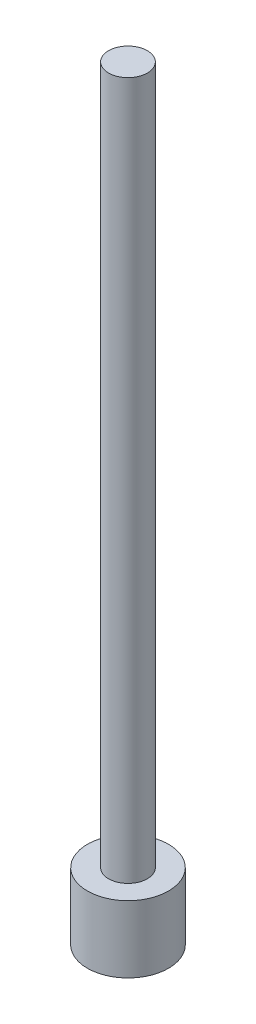
ISO-10303-21;
HEADER;
FILE_DESCRIPTION(('STEP AP214'),'2;1');
FILE_NAME('part.step','',(''),(''),'','','');
FILE_SCHEMA(('AUTOMOTIVE_DESIGN { 1 0 10303 214 1 1 1 1 }'));
ENDSEC;
DATA;
#1=APPLICATION_CONTEXT('core data for automotive mechanical design processes');
#2=APPLICATION_PROTOCOL_DEFINITION('international standard','automotive_design',2000,#1);
#3=PRODUCT_CONTEXT('',#1,'mechanical');
#4=PRODUCT('Part','Part','',(#3));
#5=PRODUCT_RELATED_PRODUCT_CATEGORY('part','',(#4));
#6=PRODUCT_DEFINITION_FORMATION('','',#4);
#7=PRODUCT_DEFINITION_CONTEXT('part definition',#1,'design');
#8=PRODUCT_DEFINITION('design','',#6,#7);
#9=PRODUCT_DEFINITION_SHAPE('','',#8);
#10=(LENGTH_UNIT() NAMED_UNIT(*) SI_UNIT(.MILLI.,.METRE.));
#11=(NAMED_UNIT(*) PLANE_ANGLE_UNIT() SI_UNIT($,.RADIAN.));
#12=(NAMED_UNIT(*) SI_UNIT($,.STERADIAN.) SOLID_ANGLE_UNIT());
#13=UNCERTAINTY_MEASURE_WITH_UNIT(LENGTH_MEASURE(1.E-05),#10,'distance_accuracy_value','');
#14=(GEOMETRIC_REPRESENTATION_CONTEXT(3) GLOBAL_UNCERTAINTY_ASSIGNED_CONTEXT((#13)) GLOBAL_UNIT_ASSIGNED_CONTEXT((#10,
#11,#12)) REPRESENTATION_CONTEXT('',''));
#15=CARTESIAN_POINT('',(0.,0.,0.));
#16=DIRECTION('',(0.,0.,1.));
#17=DIRECTION('',(1.,0.,0.));
#18=AXIS2_PLACEMENT_3D('',#15,#16,#17);
#19=CARTESIAN_POINT('',(0.,4.75,0.));
#20=DIRECTION('',(0.,-1.,0.));
#21=DIRECTION('',(0.,0.,-1.));
#22=AXIS2_PLACEMENT_3D('',#19,#20,#21);
#23=CYLINDRICAL_SURFACE('',#22,2.875);
#24=CARTESIAN_POINT('',(0.,4.75,0.));
#25=DIRECTION('',(0.,1.,0.));
#26=DIRECTION('',(0.,0.,1.));
#27=AXIS2_PLACEMENT_3D('',#24,#25,#26);
#28=CIRCLE('',#27,2.875);
#29=CARTESIAN_POINT('',(0.,4.75,2.875));
#30=VERTEX_POINT('',#29);
#31=EDGE_CURVE('E45',#30,#30,#28,.T.);
#32=ORIENTED_EDGE('',*,*,#31,.F.);
#33=EDGE_LOOP('',(#32));
#34=FACE_BOUND('',#33,.T.);
#35=CARTESIAN_POINT('',(0.,0.,0.));
#36=DIRECTION('',(0.,1.,0.));
#37=DIRECTION('',(0.,0.,1.));
#38=AXIS2_PLACEMENT_3D('',#35,#36,#37);
#39=CIRCLE('',#38,2.875);
#40=CARTESIAN_POINT('',(0.,0.,2.875));
#41=VERTEX_POINT('',#40);
#42=EDGE_CURVE('E40',#41,#41,#39,.T.);
#43=ORIENTED_EDGE('',*,*,#42,.T.);
#44=EDGE_LOOP('',(#43));
#45=FACE_BOUND('',#44,.T.);
#46=ADVANCED_FACE('F37',(#34,#45),#23,.T.);
#47=CARTESIAN_POINT('',(0.,4.75,0.));
#48=DIRECTION('',(0.,1.,0.));
#49=DIRECTION('',(0.,0.,1.));
#50=AXIS2_PLACEMENT_3D('',#47,#48,#49);
#51=PLANE('',#50);
#52=CARTESIAN_POINT('',(0.,4.75,0.));
#53=DIRECTION('',(0.,1.,0.));
#54=DIRECTION('',(0.,0.,1.));
#55=AXIS2_PLACEMENT_3D('',#52,#53,#54);
#56=CIRCLE('',#55,1.375);
#57=CARTESIAN_POINT('',(0.,4.75,1.375));
#58=VERTEX_POINT('',#57);
#59=EDGE_CURVE('E10',#58,#58,#56,.T.);
#60=ORIENTED_EDGE('',*,*,#59,.F.);
#61=EDGE_LOOP('',(#60));
#62=FACE_BOUND('',#61,.T.);
#63=ORIENTED_EDGE('',*,*,#31,.T.);
#64=EDGE_LOOP('',(#63));
#65=FACE_BOUND('',#64,.T.);
#66=ADVANCED_FACE('F65',(#62,#65),#51,.T.);
#67=CARTESIAN_POINT('',(0.,0.,0.));
#68=DIRECTION('',(0.,1.,0.));
#69=DIRECTION('',(0.,0.,1.));
#70=AXIS2_PLACEMENT_3D('',#67,#68,#69);
#71=PLANE('',#70);
#72=ORIENTED_EDGE('',*,*,#42,.F.);
#73=EDGE_LOOP('',(#72));
#74=FACE_BOUND('',#73,.T.);
#75=ADVANCED_FACE('F62',(#74),#71,.F.);
#76=CARTESIAN_POINT('',(0.,54.25,0.));
#77=DIRECTION('',(0.,-1.,0.));
#78=DIRECTION('',(0.,0.,-1.));
#79=AXIS2_PLACEMENT_3D('',#76,#77,#78);
#80=CYLINDRICAL_SURFACE('',#79,1.375);
#81=CARTESIAN_POINT('',(0.,54.25,0.));
#82=DIRECTION('',(0.,1.,0.));
#83=DIRECTION('',(0.,0.,1.));
#84=AXIS2_PLACEMENT_3D('',#81,#82,#83);
#85=CIRCLE('',#84,1.375);
#86=CARTESIAN_POINT('',(0.,54.25,1.375));
#87=VERTEX_POINT('',#86);
#88=EDGE_CURVE('E52',#87,#87,#85,.T.);
#89=ORIENTED_EDGE('',*,*,#88,.F.);
#90=EDGE_LOOP('',(#89));
#91=FACE_BOUND('',#90,.T.);
#92=ORIENTED_EDGE('',*,*,#59,.T.);
#93=EDGE_LOOP('',(#92));
#94=FACE_BOUND('',#93,.T.);
#95=ADVANCED_FACE('F64',(#91,#94),#80,.T.);
#96=CARTESIAN_POINT('',(0.,54.25,0.));
#97=DIRECTION('',(0.,1.,0.));
#98=DIRECTION('',(0.,0.,1.));
#99=AXIS2_PLACEMENT_3D('',#96,#97,#98);
#100=PLANE('',#99);
#101=ORIENTED_EDGE('',*,*,#88,.T.);
#102=EDGE_LOOP('',(#101));
#103=FACE_BOUND('',#102,.T.);
#104=ADVANCED_FACE('F70',(#103),#100,.T.);
#105=CLOSED_SHELL('',(#46,#66,#75,#95,#104));
#106=MANIFOLD_SOLID_BREP('B2',#105);
#107=ADVANCED_BREP_SHAPE_REPRESENTATION('',(#18,#106),#14);
#108=SHAPE_DEFINITION_REPRESENTATION(#9,#107);
ENDSEC;
END-ISO-10303-21;
